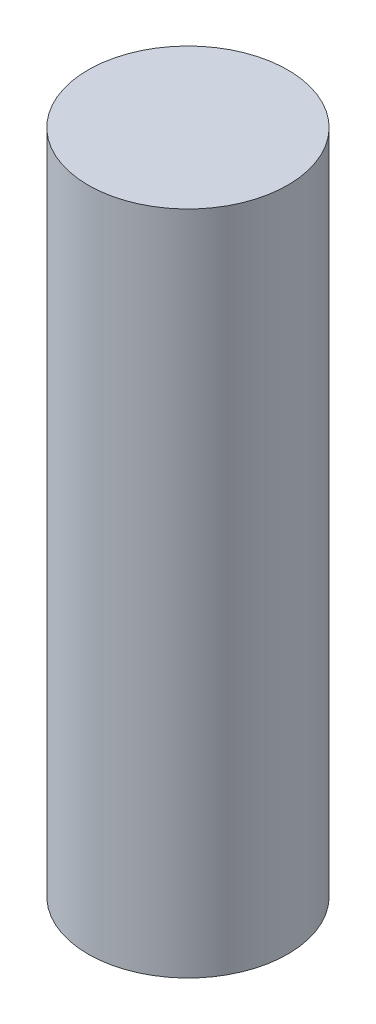
ISO-10303-21;
HEADER;
FILE_DESCRIPTION(('STEP AP214'),'2;1');
FILE_NAME('part.step','',(''),(''),'','','');
FILE_SCHEMA(('AUTOMOTIVE_DESIGN { 1 0 10303 214 1 1 1 1 }'));
ENDSEC;
DATA;
#1=APPLICATION_CONTEXT('core data for automotive mechanical design processes');
#2=APPLICATION_PROTOCOL_DEFINITION('international standard','automotive_design',2000,#1);
#3=PRODUCT_CONTEXT('',#1,'mechanical');
#4=PRODUCT('Part','Part','',(#3));
#5=PRODUCT_RELATED_PRODUCT_CATEGORY('part','',(#4));
#6=PRODUCT_DEFINITION_FORMATION('','',#4);
#7=PRODUCT_DEFINITION_CONTEXT('part definition',#1,'design');
#8=PRODUCT_DEFINITION('design','',#6,#7);
#9=PRODUCT_DEFINITION_SHAPE('','',#8);
#10=(LENGTH_UNIT() NAMED_UNIT(*) SI_UNIT(.MILLI.,.METRE.));
#11=(NAMED_UNIT(*) PLANE_ANGLE_UNIT() SI_UNIT($,.RADIAN.));
#12=(NAMED_UNIT(*) SI_UNIT($,.STERADIAN.) SOLID_ANGLE_UNIT());
#13=UNCERTAINTY_MEASURE_WITH_UNIT(LENGTH_MEASURE(1.E-05),#10,'distance_accuracy_value','');
#14=(GEOMETRIC_REPRESENTATION_CONTEXT(3) GLOBAL_UNCERTAINTY_ASSIGNED_CONTEXT((#13)) GLOBAL_UNIT_ASSIGNED_CONTEXT((#10,
#11,#12)) REPRESENTATION_CONTEXT('',''));
#15=CARTESIAN_POINT('',(0.,0.,0.));
#16=DIRECTION('',(0.,0.,1.));
#17=DIRECTION('',(1.,0.,0.));
#18=AXIS2_PLACEMENT_3D('',#15,#16,#17);
#19=CARTESIAN_POINT('',(0.,50.,0.));
#20=DIRECTION('',(0.,-1.,0.));
#21=DIRECTION('',(0.,0.,-1.));
#22=AXIS2_PLACEMENT_3D('',#19,#20,#21);
#23=CYLINDRICAL_SURFACE('',#22,7.495);
#24=CARTESIAN_POINT('',(0.,50.,0.));
#25=DIRECTION('',(0.,1.,0.));
#26=DIRECTION('',(0.,0.,1.));
#27=AXIS2_PLACEMENT_3D('',#24,#25,#26);
#28=CIRCLE('',#27,7.495);
#29=CARTESIAN_POINT('',(0.,50.,7.495));
#30=VERTEX_POINT('',#29);
#31=EDGE_CURVE('E10',#30,#30,#28,.T.);
#32=ORIENTED_EDGE('',*,*,#31,.F.);
#33=EDGE_LOOP('',(#32));
#34=FACE_BOUND('',#33,.T.);
#35=CARTESIAN_POINT('',(0.,0.,0.));
#36=DIRECTION('',(0.,1.,0.));
#37=DIRECTION('',(0.,0.,1.));
#38=AXIS2_PLACEMENT_3D('',#35,#36,#37);
#39=CIRCLE('',#38,7.495);
#40=CARTESIAN_POINT('',(0.,0.,7.495));
#41=VERTEX_POINT('',#40);
#42=EDGE_CURVE('E34',#41,#41,#39,.T.);
#43=ORIENTED_EDGE('',*,*,#42,.T.);
#44=EDGE_LOOP('',(#43));
#45=FACE_BOUND('',#44,.T.);
#46=ADVANCED_FACE('F31',(#34,#45),#23,.T.);
#47=CARTESIAN_POINT('',(0.,50.,0.));
#48=DIRECTION('',(0.,1.,0.));
#49=DIRECTION('',(0.,0.,1.));
#50=AXIS2_PLACEMENT_3D('',#47,#48,#49);
#51=PLANE('',#50);
#52=ORIENTED_EDGE('',*,*,#31,.T.);
#53=EDGE_LOOP('',(#52));
#54=FACE_BOUND('',#53,.T.);
#55=ADVANCED_FACE('F46',(#54),#51,.T.);
#56=CARTESIAN_POINT('',(0.,0.,0.));
#57=DIRECTION('',(0.,1.,0.));
#58=DIRECTION('',(0.,0.,1.));
#59=AXIS2_PLACEMENT_3D('',#56,#57,#58);
#60=PLANE('',#59);
#61=ORIENTED_EDGE('',*,*,#42,.F.);
#62=EDGE_LOOP('',(#61));
#63=FACE_BOUND('',#62,.T.);
#64=ADVANCED_FACE('F44',(#63),#60,.F.);
#65=CLOSED_SHELL('',(#46,#55,#64));
#66=MANIFOLD_SOLID_BREP('B2',#65);
#67=ADVANCED_BREP_SHAPE_REPRESENTATION('',(#18,#66),#14);
#68=SHAPE_DEFINITION_REPRESENTATION(#9,#67);
ENDSEC;
END-ISO-10303-21;
